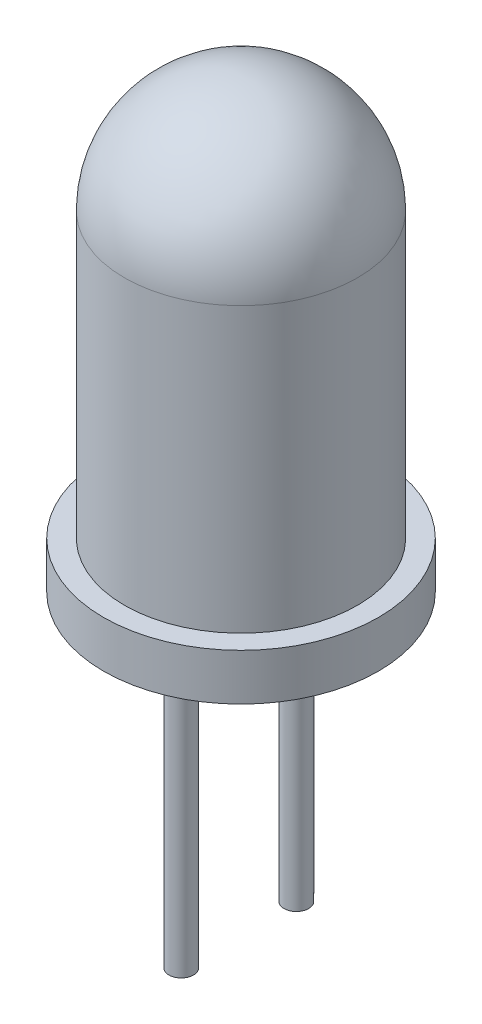
ISO-10303-21;
HEADER;
FILE_DESCRIPTION(('STEP AP214'),'2;1');
FILE_NAME('part.step','',(''),(''),'','','');
FILE_SCHEMA(('AUTOMOTIVE_DESIGN { 1 0 10303 214 1 1 1 1 }'));
ENDSEC;
DATA;
#1=APPLICATION_CONTEXT('core data for automotive mechanical design processes');
#2=APPLICATION_PROTOCOL_DEFINITION('international standard','automotive_design',2000,#1);
#3=PRODUCT_CONTEXT('',#1,'mechanical');
#4=PRODUCT('Part','Part','',(#3));
#5=PRODUCT_RELATED_PRODUCT_CATEGORY('part','',(#4));
#6=PRODUCT_DEFINITION_FORMATION('','',#4);
#7=PRODUCT_DEFINITION_CONTEXT('part definition',#1,'design');
#8=PRODUCT_DEFINITION('design','',#6,#7);
#9=PRODUCT_DEFINITION_SHAPE('','',#8);
#10=(LENGTH_UNIT() NAMED_UNIT(*) SI_UNIT(.MILLI.,.METRE.));
#11=(NAMED_UNIT(*) PLANE_ANGLE_UNIT() SI_UNIT($,.RADIAN.));
#12=(NAMED_UNIT(*) SI_UNIT($,.STERADIAN.) SOLID_ANGLE_UNIT());
#13=UNCERTAINTY_MEASURE_WITH_UNIT(LENGTH_MEASURE(1.E-05),#10,'distance_accuracy_value','');
#14=(GEOMETRIC_REPRESENTATION_CONTEXT(3) GLOBAL_UNCERTAINTY_ASSIGNED_CONTEXT((#13)) GLOBAL_UNIT_ASSIGNED_CONTEXT((#10,
#11,#12)) REPRESENTATION_CONTEXT('',''));
#15=CARTESIAN_POINT('',(0.,0.,0.));
#16=DIRECTION('',(0.,0.,1.));
#17=DIRECTION('',(1.,0.,0.));
#18=AXIS2_PLACEMENT_3D('',#15,#16,#17);
#19=CARTESIAN_POINT('',(0.,2.5,0.));
#20=DIRECTION('',(0.,1.,0.));
#21=DIRECTION('',(0.,0.,1.));
#22=AXIS2_PLACEMENT_3D('',#19,#20,#21);
#23=CYLINDRICAL_SURFACE('',#22,2.49999999999998);
#24=CARTESIAN_POINT('',(0.,0.,0.));
#25=DIRECTION('',(0.,1.,0.));
#26=DIRECTION('',(0.,0.,1.));
#27=AXIS2_PLACEMENT_3D('',#24,#25,#26);
#28=CIRCLE('',#27,2.49999999999996);
#29=CARTESIAN_POINT('',(0.,0.,2.49999999999992));
#30=VERTEX_POINT('',#29);
#31=EDGE_CURVE('E49',#30,#30,#28,.T.);
#32=ORIENTED_EDGE('',*,*,#31,.F.);
#33=EDGE_LOOP('',(#32));
#34=FACE_BOUND('',#33,.T.);
#35=CARTESIAN_POINT('',(0.,-6.09,0.));
#36=DIRECTION('',(0.,1.,0.));
#37=DIRECTION('',(0.,0.,1.));
#38=AXIS2_PLACEMENT_3D('',#35,#36,#37);
#39=CIRCLE('',#38,2.49999999999999);
#40=CARTESIAN_POINT('',(0.,-6.08999999999998,2.49999999999999));
#41=VERTEX_POINT('',#40);
#42=EDGE_CURVE('E64',#41,#41,#39,.T.);
#43=ORIENTED_EDGE('',*,*,#42,.T.);
#44=EDGE_LOOP('',(#43));
#45=FACE_BOUND('',#44,.T.);
#46=ADVANCED_FACE('F37',(#34,#45),#23,.T.);
#47=CARTESIAN_POINT('',(0.,0.,0.));
#48=DIRECTION('',(0.,1.,0.));
#49=DIRECTION('',(0.,0.,-1.));
#50=AXIS2_PLACEMENT_3D('',#47,#48,#49);
#51=SPHERICAL_SURFACE('',#50,2.5);
#52=ORIENTED_EDGE('',*,*,#31,.T.);
#53=EDGE_LOOP('',(#52));
#54=FACE_BOUND('',#53,.T.);
#55=ADVANCED_FACE('F92',(#54),#51,.T.);
#56=CARTESIAN_POINT('',(0.,-7.08999999999999,0.));
#57=DIRECTION('',(0.,1.,0.));
#58=DIRECTION('',(0.,0.,1.));
#59=AXIS2_PLACEMENT_3D('',#56,#57,#58);
#60=PLANE('',#59);
#61=CARTESIAN_POINT('',(0.,-7.09,-1.1882691725523));
#62=DIRECTION('',(0.,1.,0.));
#63=DIRECTION('',(0.,0.,1.));
#64=AXIS2_PLACEMENT_3D('',#61,#62,#63);
#65=CIRCLE('',#64,0.26475864990436);
#66=CARTESIAN_POINT('',(0.,-7.09,-0.923510522647944));
#67=VERTEX_POINT('',#66);
#68=EDGE_CURVE('E10',#67,#67,#65,.F.);
#69=ORIENTED_EDGE('',*,*,#68,.F.);
#70=EDGE_LOOP('',(#69));
#71=FACE_BOUND('',#70,.T.);
#72=CARTESIAN_POINT('',(0.,-7.08999999999998,1.2833307063566));
#73=DIRECTION('',(0.,1.,0.));
#74=DIRECTION('',(0.,0.,1.));
#75=AXIS2_PLACEMENT_3D('',#72,#73,#74);
#76=CIRCLE('',#75,0.26475864990436);
#77=CARTESIAN_POINT('',(0.,-7.08999999999998,1.54808935626096));
#78=VERTEX_POINT('',#77);
#79=EDGE_CURVE('E44',#78,#78,#76,.F.);
#80=ORIENTED_EDGE('',*,*,#79,.F.);
#81=EDGE_LOOP('',(#80));
#82=FACE_BOUND('',#81,.T.);
#83=CARTESIAN_POINT('',(0.,-7.08999999999998,0.));
#84=DIRECTION('',(0.,1.,0.));
#85=DIRECTION('',(0.,0.,1.));
#86=AXIS2_PLACEMENT_3D('',#83,#84,#85);
#87=CIRCLE('',#86,2.95);
#88=CARTESIAN_POINT('',(0.,-7.08999999999997,2.95));
#89=VERTEX_POINT('',#88);
#90=EDGE_CURVE('E54',#89,#89,#87,.T.);
#91=ORIENTED_EDGE('',*,*,#90,.F.);
#92=EDGE_LOOP('',(#91));
#93=FACE_BOUND('',#92,.T.);
#94=ADVANCED_FACE('F97',(#71,#82,#93),#60,.F.);
#95=CARTESIAN_POINT('',(0.,2.5,0.));
#96=DIRECTION('',(0.,1.,0.));
#97=DIRECTION('',(0.,0.,1.));
#98=AXIS2_PLACEMENT_3D('',#95,#96,#97);
#99=CYLINDRICAL_SURFACE('',#98,2.95);
#100=ORIENTED_EDGE('',*,*,#90,.T.);
#101=EDGE_LOOP('',(#100));
#102=FACE_BOUND('',#101,.T.);
#103=CARTESIAN_POINT('',(0.,-6.08999999999998,0.));
#104=DIRECTION('',(0.,1.,0.));
#105=DIRECTION('',(0.,0.,1.));
#106=AXIS2_PLACEMENT_3D('',#103,#104,#105);
#107=CIRCLE('',#106,2.94999999999999);
#108=CARTESIAN_POINT('',(0.,-6.08999999999997,2.94999999999999));
#109=VERTEX_POINT('',#108);
#110=EDGE_CURVE('E60',#109,#109,#107,.T.);
#111=ORIENTED_EDGE('',*,*,#110,.F.);
#112=EDGE_LOOP('',(#111));
#113=FACE_BOUND('',#112,.T.);
#114=ADVANCED_FACE('F105',(#102,#113),#99,.T.);
#115=CARTESIAN_POINT('',(0.,-6.08999999999999,-1.64336137290872E-13));
#116=DIRECTION('',(0.,1.,0.));
#117=DIRECTION('',(0.,0.,1.));
#118=AXIS2_PLACEMENT_3D('',#115,#116,#117);
#119=PLANE('',#118);
#120=ORIENTED_EDGE('',*,*,#110,.T.);
#121=EDGE_LOOP('',(#120));
#122=FACE_BOUND('',#121,.T.);
#123=ORIENTED_EDGE('',*,*,#42,.F.);
#124=EDGE_LOOP('',(#123));
#125=FACE_BOUND('',#124,.T.);
#126=ADVANCED_FACE('F103',(#122,#125),#119,.T.);
#127=CARTESIAN_POINT('',(0.,-13.44,1.28333070635664));
#128=DIRECTION('',(0.,1.,0.));
#129=DIRECTION('',(0.,0.,1.));
#130=AXIS2_PLACEMENT_3D('',#127,#128,#129);
#131=CYLINDRICAL_SURFACE('',#130,0.26475864990436);
#132=CARTESIAN_POINT('',(0.,-13.44,1.28333070635664));
#133=DIRECTION('',(0.,-1.,0.));
#134=DIRECTION('',(0.,0.,-1.));
#135=AXIS2_PLACEMENT_3D('',#132,#133,#134);
#136=CIRCLE('',#135,0.26475864990436);
#137=CARTESIAN_POINT('',(0.,-13.44,1.01857205645228));
#138=VERTEX_POINT('',#137);
#139=EDGE_CURVE('E68',#138,#138,#136,.T.);
#140=ORIENTED_EDGE('',*,*,#139,.F.);
#141=EDGE_LOOP('',(#140));
#142=FACE_BOUND('',#141,.T.);
#143=ORIENTED_EDGE('',*,*,#79,.T.);
#144=EDGE_LOOP('',(#143));
#145=FACE_BOUND('',#144,.T.);
#146=ADVANCED_FACE('F88',(#142,#145),#131,.T.);
#147=CARTESIAN_POINT('',(0.,-13.44,1.28333070635664));
#148=DIRECTION('',(0.,-1.,0.));
#149=DIRECTION('',(0.,0.,-1.));
#150=AXIS2_PLACEMENT_3D('',#147,#148,#149);
#151=PLANE('',#150);
#152=ORIENTED_EDGE('',*,*,#139,.T.);
#153=EDGE_LOOP('',(#152));
#154=FACE_BOUND('',#153,.T.);
#155=ADVANCED_FACE('F81',(#154),#151,.T.);
#156=CARTESIAN_POINT('',(0.,-13.44,-1.18826917255227));
#157=DIRECTION('',(0.,1.,0.));
#158=DIRECTION('',(0.,0.,1.));
#159=AXIS2_PLACEMENT_3D('',#156,#157,#158);
#160=CYLINDRICAL_SURFACE('',#159,0.26475864990436);
#161=CARTESIAN_POINT('',(0.,-13.44,-1.18826917255227));
#162=DIRECTION('',(0.,-1.,0.));
#163=DIRECTION('',(0.,0.,-1.));
#164=AXIS2_PLACEMENT_3D('',#161,#162,#163);
#165=CIRCLE('',#164,0.26475864990436);
#166=CARTESIAN_POINT('',(0.,-13.44,-1.45302782245663));
#167=VERTEX_POINT('',#166);
#168=EDGE_CURVE('E72',#167,#167,#165,.T.);
#169=ORIENTED_EDGE('',*,*,#168,.F.);
#170=EDGE_LOOP('',(#169));
#171=FACE_BOUND('',#170,.T.);
#172=ORIENTED_EDGE('',*,*,#68,.T.);
#173=EDGE_LOOP('',(#172));
#174=FACE_BOUND('',#173,.T.);
#175=ADVANCED_FACE('F79',(#171,#174),#160,.T.);
#176=CARTESIAN_POINT('',(0.,-13.44,-1.18826917255227));
#177=DIRECTION('',(0.,-1.,0.));
#178=DIRECTION('',(0.,0.,-1.));
#179=AXIS2_PLACEMENT_3D('',#176,#177,#178);
#180=PLANE('',#179);
#181=ORIENTED_EDGE('',*,*,#168,.T.);
#182=EDGE_LOOP('',(#181));
#183=FACE_BOUND('',#182,.T.);
#184=ADVANCED_FACE('F77',(#183),#180,.T.);
#185=CLOSED_SHELL('',(#46,#55,#94,#114,#126,#146,#155,#175,#184));
#186=MANIFOLD_SOLID_BREP('B2',#185);
#187=ADVANCED_BREP_SHAPE_REPRESENTATION('',(#18,#186),#14);
#188=SHAPE_DEFINITION_REPRESENTATION(#9,#187);
ENDSEC;
END-ISO-10303-21;
